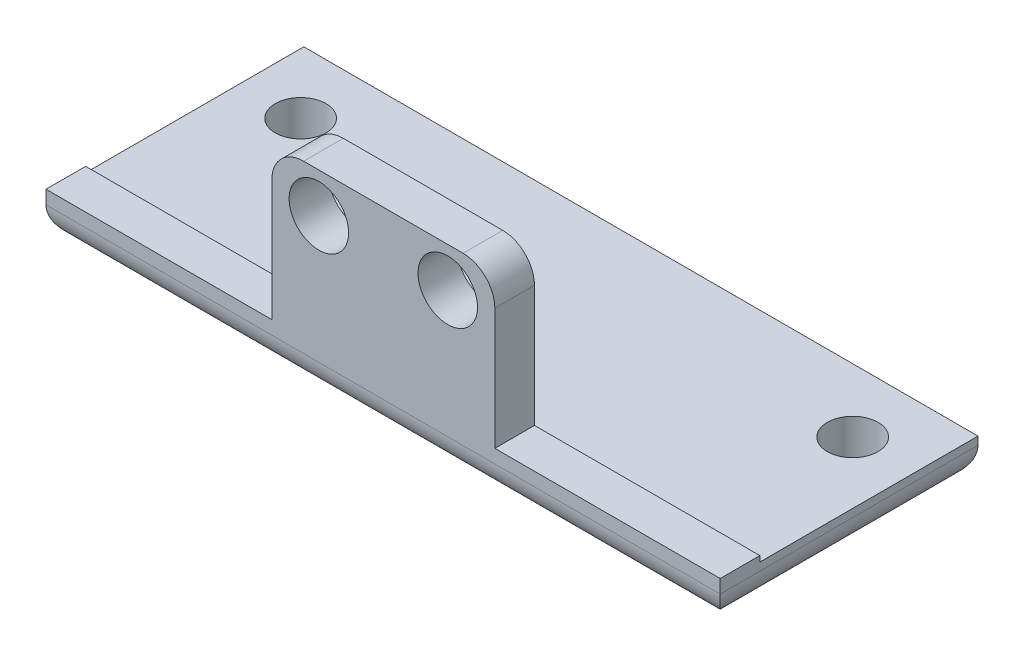
ISO-10303-21;
HEADER;
FILE_DESCRIPTION(('STEP AP214'),'2;1');
FILE_NAME('part.step','',(''),(''),'','','');
FILE_SCHEMA(('AUTOMOTIVE_DESIGN { 1 0 10303 214 1 1 1 1 }'));
ENDSEC;
DATA;
#1=APPLICATION_CONTEXT('core data for automotive mechanical design processes');
#2=APPLICATION_PROTOCOL_DEFINITION('international standard','automotive_design',2000,#1);
#3=PRODUCT_CONTEXT('',#1,'mechanical');
#4=PRODUCT('Part','Part','',(#3));
#5=PRODUCT_RELATED_PRODUCT_CATEGORY('part','',(#4));
#6=PRODUCT_DEFINITION_FORMATION('','',#4);
#7=PRODUCT_DEFINITION_CONTEXT('part definition',#1,'design');
#8=PRODUCT_DEFINITION('design','',#6,#7);
#9=PRODUCT_DEFINITION_SHAPE('','',#8);
#10=(LENGTH_UNIT() NAMED_UNIT(*) SI_UNIT(.MILLI.,.METRE.));
#11=(NAMED_UNIT(*) PLANE_ANGLE_UNIT() SI_UNIT($,.RADIAN.));
#12=(NAMED_UNIT(*) SI_UNIT($,.STERADIAN.) SOLID_ANGLE_UNIT());
#13=UNCERTAINTY_MEASURE_WITH_UNIT(LENGTH_MEASURE(1.E-05),#10,'distance_accuracy_value','');
#14=(GEOMETRIC_REPRESENTATION_CONTEXT(3) GLOBAL_UNCERTAINTY_ASSIGNED_CONTEXT((#13)) GLOBAL_UNIT_ASSIGNED_CONTEXT((#10,
#11,#12)) REPRESENTATION_CONTEXT('',''));
#15=CARTESIAN_POINT('',(0.,0.,0.));
#16=DIRECTION('',(0.,0.,1.));
#17=DIRECTION('',(1.,0.,0.));
#18=AXIS2_PLACEMENT_3D('',#15,#16,#17);
#19=CARTESIAN_POINT('',(0.,3.175,0.));
#20=DIRECTION('',(0.,-1.,0.));
#21=DIRECTION('',(0.,0.,-1.));
#22=AXIS2_PLACEMENT_3D('',#19,#20,#21);
#23=PLANE('',#22);
#24=CARTESIAN_POINT('',(49.022,3.175,-7.62));
#25=DIRECTION('',(0.,1.,0.));
#26=DIRECTION('',(0.,0.,1.));
#27=AXIS2_PLACEMENT_3D('',#24,#25,#26);
#28=CIRCLE('',#27,2.032);
#29=CARTESIAN_POINT('',(49.022,3.175,-5.588));
#30=VERTEX_POINT('',#29);
#31=EDGE_CURVE('E243',#30,#30,#28,.T.);
#32=ORIENTED_EDGE('',*,*,#31,.F.);
#33=EDGE_LOOP('',(#32));
#34=FACE_BOUND('',#33,.T.);
#35=CARTESIAN_POINT('',(4.826,3.175,-7.62));
#36=DIRECTION('',(0.,1.,0.));
#37=DIRECTION('',(0.,0.,1.));
#38=AXIS2_PLACEMENT_3D('',#35,#36,#37);
#39=CIRCLE('',#38,2.032);
#40=CARTESIAN_POINT('',(4.826,3.175,-5.588));
#41=VERTEX_POINT('',#40);
#42=EDGE_CURVE('E239',#41,#41,#39,.T.);
#43=ORIENTED_EDGE('',*,*,#42,.F.);
#44=EDGE_LOOP('',(#43));
#45=FACE_BOUND('',#44,.T.);
#46=DIRECTION('',(-1.,0.,0.));
#47=VECTOR('',#46,1.);
#48=CARTESIAN_POINT('',(0.,3.175,4.7625));
#49=LINE('',#48,#47);
#50=CARTESIAN_POINT('',(53.975,3.175,4.7625));
#51=VERTEX_POINT('',#50);
#52=CARTESIAN_POINT('',(0.,3.175,4.7625));
#53=VERTEX_POINT('',#52);
#54=EDGE_CURVE('E218',#51,#53,#49,.T.);
#55=ORIENTED_EDGE('',*,*,#54,.F.);
#56=DIRECTION('',(0.,0.,-1.));
#57=VECTOR('',#56,1.);
#58=CARTESIAN_POINT('',(53.975,3.175,0.));
#59=LINE('',#58,#57);
#60=CARTESIAN_POINT('',(53.975,3.175,-12.7));
#61=VERTEX_POINT('',#60);
#62=EDGE_CURVE('E253',#51,#61,#59,.T.);
#63=ORIENTED_EDGE('',*,*,#62,.T.);
#64=DIRECTION('',(-1.,0.,0.));
#65=VECTOR('',#64,1.);
#66=CARTESIAN_POINT('',(0.,3.175,-12.7));
#67=LINE('',#66,#65);
#68=CARTESIAN_POINT('',(0.,3.175,-12.7));
#69=VERTEX_POINT('',#68);
#70=EDGE_CURVE('E256',#61,#69,#67,.T.);
#71=ORIENTED_EDGE('',*,*,#70,.T.);
#72=DIRECTION('',(0.,0.,1.));
#73=VECTOR('',#72,1.);
#74=CARTESIAN_POINT('',(0.,3.175,0.));
#75=LINE('',#74,#73);
#76=EDGE_CURVE('E238',#69,#53,#75,.T.);
#77=ORIENTED_EDGE('',*,*,#76,.T.);
#78=EDGE_LOOP('',(#55,#63,#71,#77));
#79=FACE_BOUND('',#78,.T.);
#80=ADVANCED_FACE('F43',(#34,#45,#79),#23,.F.);
#81=CARTESIAN_POINT('',(0.,3.175,0.));
#82=DIRECTION('',(1.,0.,0.));
#83=DIRECTION('',(0.,0.,-1.));
#84=AXIS2_PLACEMENT_3D('',#81,#82,#83);
#85=PLANE('',#84);
#86=DIRECTION('',(0.,-1.,0.));
#87=VECTOR('',#86,1.);
#88=CARTESIAN_POINT('',(0.,3.175,-12.7));
#89=LINE('',#88,#87);
#90=CARTESIAN_POINT('',(0.,2.54,-12.7));
#91=VERTEX_POINT('',#90);
#92=EDGE_CURVE('E259',#69,#91,#89,.T.);
#93=ORIENTED_EDGE('',*,*,#92,.T.);
#94=DIRECTION('',(0.,0.,1.));
#95=VECTOR('',#94,1.);
#96=CARTESIAN_POINT('',(0.,2.54,7.9375));
#97=LINE('',#96,#95);
#98=CARTESIAN_POINT('',(0.,2.54,7.9375));
#99=VERTEX_POINT('',#98);
#100=EDGE_CURVE('E153',#91,#99,#97,.T.);
#101=ORIENTED_EDGE('',*,*,#100,.T.);
#102=DIRECTION('',(0.,1.,0.));
#103=VECTOR('',#102,1.);
#104=CARTESIAN_POINT('',(0.,0.,7.9375));
#105=LINE('',#104,#103);
#106=CARTESIAN_POINT('',(0.,3.62073276793495,7.9375));
#107=VERTEX_POINT('',#106);
#108=EDGE_CURVE('E146',#99,#107,#105,.T.);
#109=ORIENTED_EDGE('',*,*,#108,.T.);
#110=DIRECTION('',(0.,0.,1.));
#111=VECTOR('',#110,1.);
#112=CARTESIAN_POINT('',(0.,3.62073276793495,-4.7625));
#113=LINE('',#112,#111);
#114=CARTESIAN_POINT('',(0.,3.62073276793495,4.7625));
#115=VERTEX_POINT('',#114);
#116=EDGE_CURVE('E150',#115,#107,#113,.T.);
#117=ORIENTED_EDGE('',*,*,#116,.F.);
#118=DIRECTION('',(0.,-1.,0.));
#119=VECTOR('',#118,1.);
#120=CARTESIAN_POINT('',(0.,15.875,4.7625));
#121=LINE('',#120,#119);
#122=EDGE_CURVE('E222',#115,#53,#121,.T.);
#123=ORIENTED_EDGE('',*,*,#122,.T.);
#124=ORIENTED_EDGE('',*,*,#76,.F.);
#125=EDGE_LOOP('',(#93,#101,#109,#117,#123,#124));
#126=FACE_BOUND('',#125,.T.);
#127=ADVANCED_FACE('F149',(#126),#85,.F.);
#128=CARTESIAN_POINT('',(53.975,3.175,0.));
#129=DIRECTION('',(-1.,0.,0.));
#130=DIRECTION('',(0.,0.,1.));
#131=AXIS2_PLACEMENT_3D('',#128,#129,#130);
#132=PLANE('',#131);
#133=DIRECTION('',(0.,1.,0.));
#134=VECTOR('',#133,1.);
#135=CARTESIAN_POINT('',(53.975,0.,7.9375));
#136=LINE('',#135,#134);
#137=CARTESIAN_POINT('',(53.975,2.54,7.9375));
#138=VERTEX_POINT('',#137);
#139=CARTESIAN_POINT('',(53.975,3.62073276793495,7.9375));
#140=VERTEX_POINT('',#139);
#141=EDGE_CURVE('E159',#138,#140,#136,.T.);
#142=ORIENTED_EDGE('',*,*,#141,.F.);
#143=DIRECTION('',(0.,0.,-1.));
#144=VECTOR('',#143,1.);
#145=CARTESIAN_POINT('',(53.975,2.54,-12.7));
#146=LINE('',#145,#144);
#147=CARTESIAN_POINT('',(53.975,2.54,-12.7));
#148=VERTEX_POINT('',#147);
#149=EDGE_CURVE('E300',#138,#148,#146,.T.);
#150=ORIENTED_EDGE('',*,*,#149,.T.);
#151=DIRECTION('',(0.,-1.,0.));
#152=VECTOR('',#151,1.);
#153=CARTESIAN_POINT('',(53.975,3.175,-12.7));
#154=LINE('',#153,#152);
#155=EDGE_CURVE('E262',#61,#148,#154,.T.);
#156=ORIENTED_EDGE('',*,*,#155,.F.);
#157=ORIENTED_EDGE('',*,*,#62,.F.);
#158=DIRECTION('',(0.,-1.,0.));
#159=VECTOR('',#158,1.);
#160=CARTESIAN_POINT('',(53.975,15.875,4.7625));
#161=LINE('',#160,#159);
#162=CARTESIAN_POINT('',(53.975,3.62073276793495,4.7625));
#163=VERTEX_POINT('',#162);
#164=EDGE_CURVE('E160',#163,#51,#161,.T.);
#165=ORIENTED_EDGE('',*,*,#164,.F.);
#166=DIRECTION('',(0.,0.,1.));
#167=VECTOR('',#166,1.);
#168=CARTESIAN_POINT('',(53.975,3.62073276793495,-4.7625));
#169=LINE('',#168,#167);
#170=EDGE_CURVE('E192',#163,#140,#169,.T.);
#171=ORIENTED_EDGE('',*,*,#170,.T.);
#172=EDGE_LOOP('',(#142,#150,#156,#157,#165,#171));
#173=FACE_BOUND('',#172,.T.);
#174=ADVANCED_FACE('F358',(#173),#132,.F.);
#175=CARTESIAN_POINT('',(0.,3.175,-12.7));
#176=DIRECTION('',(0.,0.,1.));
#177=DIRECTION('',(1.,0.,0.));
#178=AXIS2_PLACEMENT_3D('',#175,#176,#177);
#179=PLANE('',#178);
#180=ORIENTED_EDGE('',*,*,#155,.T.);
#181=DIRECTION('',(-1.,0.,0.));
#182=VECTOR('',#181,1.);
#183=CARTESIAN_POINT('',(0.,2.54,-12.7));
#184=LINE('',#183,#182);
#185=EDGE_CURVE('E303',#148,#91,#184,.T.);
#186=ORIENTED_EDGE('',*,*,#185,.T.);
#187=ORIENTED_EDGE('',*,*,#92,.F.);
#188=ORIENTED_EDGE('',*,*,#70,.F.);
#189=EDGE_LOOP('',(#180,#186,#187,#188));
#190=FACE_BOUND('',#189,.T.);
#191=ADVANCED_FACE('F387',(#190),#179,.F.);
#192=CARTESIAN_POINT('',(0.,0.,0.));
#193=DIRECTION('',(0.,-1.,0.));
#194=DIRECTION('',(0.,0.,-1.));
#195=AXIS2_PLACEMENT_3D('',#192,#193,#194);
#196=PLANE('',#195);
#197=DIRECTION('',(0.,0.,-1.));
#198=VECTOR('',#197,1.);
#199=CARTESIAN_POINT('',(51.435,0.,7.9375));
#200=LINE('',#199,#198);
#201=CARTESIAN_POINT('',(51.435,0.,-10.16));
#202=VERTEX_POINT('',#201);
#203=CARTESIAN_POINT('',(51.435,0.,5.3975));
#204=VERTEX_POINT('',#203);
#205=EDGE_CURVE('E293',#202,#204,#200,.F.);
#206=ORIENTED_EDGE('',*,*,#205,.T.);
#207=DIRECTION('',(1.,0.,0.));
#208=VECTOR('',#207,1.);
#209=CARTESIAN_POINT('',(0.,0.,5.3975));
#210=LINE('',#209,#208);
#211=CARTESIAN_POINT('',(2.54,0.,5.3975));
#212=VERTEX_POINT('',#211);
#213=EDGE_CURVE('E296',#204,#212,#210,.F.);
#214=ORIENTED_EDGE('',*,*,#213,.T.);
#215=DIRECTION('',(0.,0.,1.));
#216=VECTOR('',#215,1.);
#217=CARTESIAN_POINT('',(2.54,0.,-12.7));
#218=LINE('',#217,#216);
#219=CARTESIAN_POINT('',(2.54,0.,-10.16));
#220=VERTEX_POINT('',#219);
#221=EDGE_CURVE('E287',#212,#220,#218,.F.);
#222=ORIENTED_EDGE('',*,*,#221,.T.);
#223=DIRECTION('',(-1.,0.,0.));
#224=VECTOR('',#223,1.);
#225=CARTESIAN_POINT('',(53.975,0.,-10.16));
#226=LINE('',#225,#224);
#227=EDGE_CURVE('E290',#220,#202,#226,.F.);
#228=ORIENTED_EDGE('',*,*,#227,.T.);
#229=EDGE_LOOP('',(#206,#214,#222,#228));
#230=FACE_BOUND('',#229,.T.);
#231=CARTESIAN_POINT('',(4.826,0.,-7.62));
#232=DIRECTION('',(0.,1.,0.));
#233=DIRECTION('',(0.,0.,1.));
#234=AXIS2_PLACEMENT_3D('',#231,#232,#233);
#235=CIRCLE('',#234,2.032);
#236=CARTESIAN_POINT('',(4.826,0.,-5.588));
#237=VERTEX_POINT('',#236);
#238=EDGE_CURVE('E234',#237,#237,#235,.T.);
#239=ORIENTED_EDGE('',*,*,#238,.T.);
#240=EDGE_LOOP('',(#239));
#241=FACE_BOUND('',#240,.T.);
#242=CARTESIAN_POINT('',(49.022,0.,-7.62));
#243=DIRECTION('',(0.,1.,0.));
#244=DIRECTION('',(0.,0.,1.));
#245=AXIS2_PLACEMENT_3D('',#242,#243,#244);
#246=CIRCLE('',#245,2.032);
#247=CARTESIAN_POINT('',(49.022,0.,-5.588));
#248=VERTEX_POINT('',#247);
#249=EDGE_CURVE('E232',#248,#248,#246,.T.);
#250=ORIENTED_EDGE('',*,*,#249,.T.);
#251=EDGE_LOOP('',(#250));
#252=FACE_BOUND('',#251,.T.);
#253=ADVANCED_FACE('F346',(#230,#241,#252),#196,.T.);
#254=CARTESIAN_POINT('',(49.022,0.,-7.62));
#255=DIRECTION('',(0.,1.,0.));
#256=DIRECTION('',(0.,0.,1.));
#257=AXIS2_PLACEMENT_3D('',#254,#255,#256);
#258=CYLINDRICAL_SURFACE('',#257,2.032);
#259=ORIENTED_EDGE('',*,*,#249,.F.);
#260=EDGE_LOOP('',(#259));
#261=FACE_BOUND('',#260,.T.);
#262=ORIENTED_EDGE('',*,*,#31,.T.);
#263=EDGE_LOOP('',(#262));
#264=FACE_BOUND('',#263,.T.);
#265=ADVANCED_FACE('F394',(#261,#264),#258,.F.);
#266=CARTESIAN_POINT('',(4.826,0.,-7.62));
#267=DIRECTION('',(0.,1.,0.));
#268=DIRECTION('',(0.,0.,1.));
#269=AXIS2_PLACEMENT_3D('',#266,#267,#268);
#270=CYLINDRICAL_SURFACE('',#269,2.032);
#271=ORIENTED_EDGE('',*,*,#238,.F.);
#272=EDGE_LOOP('',(#271));
#273=FACE_BOUND('',#272,.T.);
#274=ORIENTED_EDGE('',*,*,#42,.T.);
#275=EDGE_LOOP('',(#274));
#276=FACE_BOUND('',#275,.T.);
#277=ADVANCED_FACE('F409',(#273,#276),#270,.F.);
#278=CARTESIAN_POINT('',(0.,0.,7.9375));
#279=DIRECTION('',(0.,0.,1.));
#280=DIRECTION('',(1.,0.,0.));
#281=AXIS2_PLACEMENT_3D('',#278,#279,#280);
#282=PLANE('',#281);
#283=ORIENTED_EDGE('',*,*,#108,.F.);
#284=DIRECTION('',(1.,0.,0.));
#285=VECTOR('',#284,1.);
#286=CARTESIAN_POINT('',(0.,2.54,7.9375));
#287=LINE('',#286,#285);
#288=EDGE_CURVE('E284',#99,#138,#287,.T.);
#289=ORIENTED_EDGE('',*,*,#288,.T.);
#290=ORIENTED_EDGE('',*,*,#141,.T.);
#291=DIRECTION('',(1.,0.,0.));
#292=VECTOR('',#291,1.);
#293=CARTESIAN_POINT('',(53.975,3.62073276793495,7.9375));
#294=LINE('',#293,#292);
#295=CARTESIAN_POINT('',(35.9306684465608,3.62073276793495,7.9375));
#296=VERTEX_POINT('',#295);
#297=EDGE_CURVE('E182',#296,#140,#294,.T.);
#298=ORIENTED_EDGE('',*,*,#297,.F.);
#299=DIRECTION('',(0.,-1.,0.));
#300=VECTOR('',#299,1.);
#301=CARTESIAN_POINT('',(35.9306684465608,15.875,7.9375));
#302=LINE('',#301,#300);
#303=CARTESIAN_POINT('',(35.9306684465608,13.335,7.9375));
#304=VERTEX_POINT('',#303);
#305=EDGE_CURVE('E177',#304,#296,#302,.T.);
#306=ORIENTED_EDGE('',*,*,#305,.F.);
#307=CARTESIAN_POINT('',(33.3906684465608,13.335,7.9375));
#308=DIRECTION('',(0.,0.,1.));
#309=DIRECTION('',(1.,0.,0.));
#310=AXIS2_PLACEMENT_3D('',#307,#308,#309);
#311=CIRCLE('',#310,2.54);
#312=CARTESIAN_POINT('',(33.3906684465608,15.875,7.9375));
#313=VERTEX_POINT('',#312);
#314=EDGE_CURVE('E281',#304,#313,#311,.T.);
#315=ORIENTED_EDGE('',*,*,#314,.T.);
#316=DIRECTION('',(1.,0.,0.));
#317=VECTOR('',#316,1.);
#318=CARTESIAN_POINT('',(0.,15.875,7.9375));
#319=LINE('',#318,#317);
#320=CARTESIAN_POINT('',(20.6241937373089,15.875,7.9375));
#321=VERTEX_POINT('',#320);
#322=EDGE_CURVE('E213',#321,#313,#319,.T.);
#323=ORIENTED_EDGE('',*,*,#322,.F.);
#324=CARTESIAN_POINT('',(20.6241937373089,13.335,7.9375));
#325=DIRECTION('',(0.,0.,1.));
#326=DIRECTION('',(1.,0.,0.));
#327=AXIS2_PLACEMENT_3D('',#324,#325,#326);
#328=CIRCLE('',#327,2.54);
#329=CARTESIAN_POINT('',(18.0841937373089,13.335,7.9375));
#330=VERTEX_POINT('',#329);
#331=EDGE_CURVE('E278',#321,#330,#328,.T.);
#332=ORIENTED_EDGE('',*,*,#331,.T.);
#333=DIRECTION('',(0.,1.,0.));
#334=VECTOR('',#333,1.);
#335=CARTESIAN_POINT('',(18.0841937373089,15.875,7.9375));
#336=LINE('',#335,#334);
#337=CARTESIAN_POINT('',(18.0841937373089,3.62073276793495,7.9375));
#338=VERTEX_POINT('',#337);
#339=EDGE_CURVE('E172',#338,#330,#336,.T.);
#340=ORIENTED_EDGE('',*,*,#339,.F.);
#341=DIRECTION('',(1.,0.,0.));
#342=VECTOR('',#341,1.);
#343=CARTESIAN_POINT('',(0.,3.62073276793495,7.9375));
#344=LINE('',#343,#342);
#345=EDGE_CURVE('E166',#107,#338,#344,.T.);
#346=ORIENTED_EDGE('',*,*,#345,.F.);
#347=EDGE_LOOP('',(#283,#289,#290,#298,#306,#315,#323,#332,#340,#346));
#348=FACE_BOUND('',#347,.T.);
#349=CARTESIAN_POINT('',(21.844,12.7,7.9375));
#350=DIRECTION('',(0.,0.,1.));
#351=DIRECTION('',(1.,0.,0.));
#352=AXIS2_PLACEMENT_3D('',#349,#350,#351);
#353=CIRCLE('',#352,2.38125);
#354=CARTESIAN_POINT('',(24.22525,12.7,7.9375));
#355=VERTEX_POINT('',#354);
#356=EDGE_CURVE('E205',#355,#355,#353,.T.);
#357=ORIENTED_EDGE('',*,*,#356,.F.);
#358=EDGE_LOOP('',(#357));
#359=FACE_BOUND('',#358,.T.);
#360=CARTESIAN_POINT('',(32.16275,12.7,7.9375));
#361=DIRECTION('',(0.,0.,1.));
#362=DIRECTION('',(1.,0.,0.));
#363=AXIS2_PLACEMENT_3D('',#360,#361,#362);
#364=CIRCLE('',#363,2.38125);
#365=CARTESIAN_POINT('',(34.544,12.7,7.9375));
#366=VERTEX_POINT('',#365);
#367=EDGE_CURVE('E204',#366,#366,#364,.T.);
#368=ORIENTED_EDGE('',*,*,#367,.F.);
#369=EDGE_LOOP('',(#368));
#370=FACE_BOUND('',#369,.T.);
#371=ADVANCED_FACE('F174',(#348,#359,#370),#282,.T.);
#372=CARTESIAN_POINT('',(0.,15.875,4.7625));
#373=DIRECTION('',(0.,0.,1.));
#374=DIRECTION('',(1.,0.,0.));
#375=AXIS2_PLACEMENT_3D('',#372,#373,#374);
#376=PLANE('',#375);
#377=CARTESIAN_POINT('',(21.844,12.7,4.7625));
#378=DIRECTION('',(0.,0.,1.));
#379=DIRECTION('',(1.,0.,0.));
#380=AXIS2_PLACEMENT_3D('',#377,#378,#379);
#381=CIRCLE('',#380,2.38125);
#382=CARTESIAN_POINT('',(24.22525,12.7,4.7625));
#383=VERTEX_POINT('',#382);
#384=EDGE_CURVE('E226',#383,#383,#381,.T.);
#385=ORIENTED_EDGE('',*,*,#384,.T.);
#386=EDGE_LOOP('',(#385));
#387=FACE_BOUND('',#386,.T.);
#388=CARTESIAN_POINT('',(32.16275,12.7,4.7625));
#389=DIRECTION('',(0.,0.,1.));
#390=DIRECTION('',(1.,0.,0.));
#391=AXIS2_PLACEMENT_3D('',#388,#389,#390);
#392=CIRCLE('',#391,2.38125);
#393=CARTESIAN_POINT('',(34.544,12.7,4.7625));
#394=VERTEX_POINT('',#393);
#395=EDGE_CURVE('E209',#394,#394,#392,.T.);
#396=ORIENTED_EDGE('',*,*,#395,.T.);
#397=EDGE_LOOP('',(#396));
#398=FACE_BOUND('',#397,.T.);
#399=DIRECTION('',(-1.,0.,0.));
#400=VECTOR('',#399,1.);
#401=CARTESIAN_POINT('',(0.,15.875,4.7625));
#402=LINE('',#401,#400);
#403=CARTESIAN_POINT('',(33.3906684465608,15.875,4.7625));
#404=VERTEX_POINT('',#403);
#405=CARTESIAN_POINT('',(20.6241937373089,15.875,4.7625));
#406=VERTEX_POINT('',#405);
#407=EDGE_CURVE('E217',#404,#406,#402,.T.);
#408=ORIENTED_EDGE('',*,*,#407,.F.);
#409=CARTESIAN_POINT('',(33.3906684465608,13.335,4.7625));
#410=DIRECTION('',(0.,0.,1.));
#411=DIRECTION('',(1.,0.,0.));
#412=AXIS2_PLACEMENT_3D('',#409,#410,#411);
#413=CIRCLE('',#412,2.54);
#414=CARTESIAN_POINT('',(35.9306684465608,13.335,4.7625));
#415=VERTEX_POINT('',#414);
#416=EDGE_CURVE('E61',#404,#415,#413,.F.);
#417=ORIENTED_EDGE('',*,*,#416,.T.);
#418=DIRECTION('',(0.,-1.,0.));
#419=VECTOR('',#418,1.);
#420=CARTESIAN_POINT('',(35.9306684465608,15.875,4.7625));
#421=LINE('',#420,#419);
#422=CARTESIAN_POINT('',(35.9306684465608,3.62073276793495,4.7625));
#423=VERTEX_POINT('',#422);
#424=EDGE_CURVE('E186',#415,#423,#421,.T.);
#425=ORIENTED_EDGE('',*,*,#424,.T.);
#426=DIRECTION('',(1.,0.,0.));
#427=VECTOR('',#426,1.);
#428=CARTESIAN_POINT('',(0.,3.62073276793495,4.7625));
#429=LINE('',#428,#427);
#430=EDGE_CURVE('E266',#423,#163,#429,.T.);
#431=ORIENTED_EDGE('',*,*,#430,.T.);
#432=ORIENTED_EDGE('',*,*,#164,.T.);
#433=ORIENTED_EDGE('',*,*,#54,.T.);
#434=ORIENTED_EDGE('',*,*,#122,.F.);
#435=DIRECTION('',(1.,0.,0.));
#436=VECTOR('',#435,1.);
#437=CARTESIAN_POINT('',(0.,3.62073276793495,4.7625));
#438=LINE('',#437,#436);
#439=CARTESIAN_POINT('',(18.0841937373089,3.62073276793495,4.7625));
#440=VERTEX_POINT('',#439);
#441=EDGE_CURVE('E169',#115,#440,#438,.T.);
#442=ORIENTED_EDGE('',*,*,#441,.T.);
#443=DIRECTION('',(0.,1.,0.));
#444=VECTOR('',#443,1.);
#445=CARTESIAN_POINT('',(18.0841937373089,15.875,4.7625));
#446=LINE('',#445,#444);
#447=CARTESIAN_POINT('',(18.0841937373089,13.335,4.7625));
#448=VERTEX_POINT('',#447);
#449=EDGE_CURVE('E201',#440,#448,#446,.T.);
#450=ORIENTED_EDGE('',*,*,#449,.T.);
#451=CARTESIAN_POINT('',(20.6241937373089,13.335,4.7625));
#452=DIRECTION('',(0.,0.,1.));
#453=DIRECTION('',(1.,0.,0.));
#454=AXIS2_PLACEMENT_3D('',#451,#452,#453);
#455=CIRCLE('',#454,2.54);
#456=EDGE_CURVE('E316',#448,#406,#455,.F.);
#457=ORIENTED_EDGE('',*,*,#456,.T.);
#458=EDGE_LOOP('',(#408,#417,#425,#431,#432,#433,#434,#442,#450,#457));
#459=FACE_BOUND('',#458,.T.);
#460=ADVANCED_FACE('F365',(#387,#398,#459),#376,.F.);
#461=CARTESIAN_POINT('',(0.,15.875,0.));
#462=DIRECTION('',(0.,-1.,0.));
#463=DIRECTION('',(0.,0.,-1.));
#464=AXIS2_PLACEMENT_3D('',#461,#462,#463);
#465=PLANE('',#464);
#466=ORIENTED_EDGE('',*,*,#322,.T.);
#467=DIRECTION('',(0.,0.,-1.));
#468=VECTOR('',#467,1.);
#469=CARTESIAN_POINT('',(33.3906684465608,15.875,0.));
#470=LINE('',#469,#468);
#471=EDGE_CURVE('E312',#313,#404,#470,.T.);
#472=ORIENTED_EDGE('',*,*,#471,.T.);
#473=ORIENTED_EDGE('',*,*,#407,.T.);
#474=DIRECTION('',(0.,0.,1.));
#475=VECTOR('',#474,1.);
#476=CARTESIAN_POINT('',(20.6241937373089,15.875,0.));
#477=LINE('',#476,#475);
#478=EDGE_CURVE('E308',#406,#321,#477,.T.);
#479=ORIENTED_EDGE('',*,*,#478,.T.);
#480=EDGE_LOOP('',(#466,#472,#473,#479));
#481=FACE_BOUND('',#480,.T.);
#482=ADVANCED_FACE('F377',(#481),#465,.F.);
#483=CARTESIAN_POINT('',(32.16275,12.7,-4.7625));
#484=DIRECTION('',(0.,0.,1.));
#485=DIRECTION('',(1.,0.,0.));
#486=AXIS2_PLACEMENT_3D('',#483,#484,#485);
#487=CYLINDRICAL_SURFACE('',#486,2.38125);
#488=ORIENTED_EDGE('',*,*,#367,.T.);
#489=EDGE_LOOP('',(#488));
#490=FACE_BOUND('',#489,.T.);
#491=ORIENTED_EDGE('',*,*,#395,.F.);
#492=EDGE_LOOP('',(#491));
#493=FACE_BOUND('',#492,.T.);
#494=ADVANCED_FACE('F421',(#490,#493),#487,.F.);
#495=CARTESIAN_POINT('',(21.844,12.7,-4.7625));
#496=DIRECTION('',(0.,0.,1.));
#497=DIRECTION('',(1.,0.,0.));
#498=AXIS2_PLACEMENT_3D('',#495,#496,#497);
#499=CYLINDRICAL_SURFACE('',#498,2.38125);
#500=ORIENTED_EDGE('',*,*,#356,.T.);
#501=EDGE_LOOP('',(#500));
#502=FACE_BOUND('',#501,.T.);
#503=ORIENTED_EDGE('',*,*,#384,.F.);
#504=EDGE_LOOP('',(#503));
#505=FACE_BOUND('',#504,.T.);
#506=ADVANCED_FACE('F424',(#502,#505),#499,.F.);
#507=CARTESIAN_POINT('',(53.975,3.62073276793495,-4.7625));
#508=DIRECTION('',(0.,-1.,0.));
#509=DIRECTION('',(0.,0.,-1.));
#510=AXIS2_PLACEMENT_3D('',#507,#508,#509);
#511=PLANE('',#510);
#512=DIRECTION('',(0.,0.,1.));
#513=VECTOR('',#512,1.);
#514=CARTESIAN_POINT('',(35.9306684465608,3.62073276793495,-4.7625));
#515=LINE('',#514,#513);
#516=EDGE_CURVE('E188',#423,#296,#515,.T.);
#517=ORIENTED_EDGE('',*,*,#516,.T.);
#518=ORIENTED_EDGE('',*,*,#297,.T.);
#519=ORIENTED_EDGE('',*,*,#170,.F.);
#520=ORIENTED_EDGE('',*,*,#430,.F.);
#521=EDGE_LOOP('',(#517,#518,#519,#520));
#522=FACE_BOUND('',#521,.T.);
#523=ADVANCED_FACE('F363',(#522),#511,.F.);
#524=CARTESIAN_POINT('',(35.9306684465608,15.875,-4.7625));
#525=DIRECTION('',(-1.,0.,0.));
#526=DIRECTION('',(0.,0.,1.));
#527=AXIS2_PLACEMENT_3D('',#524,#525,#526);
#528=PLANE('',#527);
#529=ORIENTED_EDGE('',*,*,#424,.F.);
#530=DIRECTION('',(0.,0.,-1.));
#531=VECTOR('',#530,1.);
#532=CARTESIAN_POINT('',(35.9306684465608,13.335,-4.7625));
#533=LINE('',#532,#531);
#534=EDGE_CURVE('E53',#415,#304,#533,.F.);
#535=ORIENTED_EDGE('',*,*,#534,.T.);
#536=ORIENTED_EDGE('',*,*,#305,.T.);
#537=ORIENTED_EDGE('',*,*,#516,.F.);
#538=EDGE_LOOP('',(#529,#535,#536,#537));
#539=FACE_BOUND('',#538,.T.);
#540=ADVANCED_FACE('F369',(#539),#528,.F.);
#541=CARTESIAN_POINT('',(0.,3.62073276793495,-4.7625));
#542=DIRECTION('',(0.,-1.,0.));
#543=DIRECTION('',(0.,0.,-1.));
#544=AXIS2_PLACEMENT_3D('',#541,#542,#543);
#545=PLANE('',#544);
#546=ORIENTED_EDGE('',*,*,#116,.T.);
#547=ORIENTED_EDGE('',*,*,#345,.T.);
#548=DIRECTION('',(0.,0.,1.));
#549=VECTOR('',#548,1.);
#550=CARTESIAN_POINT('',(18.0841937373089,3.62073276793495,-4.7625));
#551=LINE('',#550,#549);
#552=EDGE_CURVE('E171',#440,#338,#551,.T.);
#553=ORIENTED_EDGE('',*,*,#552,.F.);
#554=ORIENTED_EDGE('',*,*,#441,.F.);
#555=EDGE_LOOP('',(#546,#547,#553,#554));
#556=FACE_BOUND('',#555,.T.);
#557=ADVANCED_FACE('F164',(#556),#545,.F.);
#558=CARTESIAN_POINT('',(18.0841937373089,15.875,-4.7625));
#559=DIRECTION('',(1.,0.,0.));
#560=DIRECTION('',(0.,0.,-1.));
#561=AXIS2_PLACEMENT_3D('',#558,#559,#560);
#562=PLANE('',#561);
#563=ORIENTED_EDGE('',*,*,#339,.T.);
#564=DIRECTION('',(0.,0.,1.));
#565=VECTOR('',#564,1.);
#566=CARTESIAN_POINT('',(18.0841937373089,13.335,-4.7625));
#567=LINE('',#566,#565);
#568=EDGE_CURVE('E11',#330,#448,#567,.F.);
#569=ORIENTED_EDGE('',*,*,#568,.T.);
#570=ORIENTED_EDGE('',*,*,#449,.F.);
#571=ORIENTED_EDGE('',*,*,#552,.T.);
#572=EDGE_LOOP('',(#563,#569,#570,#571));
#573=FACE_BOUND('',#572,.T.);
#574=ADVANCED_FACE('F381',(#573),#562,.F.);
#575=CARTESIAN_POINT('',(0.,2.54,-10.16));
#576=DIRECTION('',(1.,0.,0.));
#577=DIRECTION('',(0.,0.,-1.));
#578=AXIS2_PLACEMENT_3D('',#575,#576,#577);
#579=CYLINDRICAL_SURFACE('',#578,2.54);
#580=CARTESIAN_POINT('',(51.435,2.54,-10.16));
#581=DIRECTION('',(0.707106781186547,0.,0.707106781186547));
#582=DIRECTION('',(0.707106781186547,0.,-0.707106781186547));
#583=AXIS2_PLACEMENT_3D('',#580,#581,#582);
#584=ELLIPSE('',#583,3.59210244842766,2.54);
#585=EDGE_CURVE('E328',#202,#148,#584,.T.);
#586=ORIENTED_EDGE('',*,*,#585,.F.);
#587=ORIENTED_EDGE('',*,*,#227,.F.);
#588=CARTESIAN_POINT('',(2.54,2.54,-10.16));
#589=DIRECTION('',(0.707106781186547,0.,-0.707106781186547));
#590=DIRECTION('',(-0.707106781186547,0.,-0.707106781186547));
#591=AXIS2_PLACEMENT_3D('',#588,#589,#590);
#592=ELLIPSE('',#591,3.59210244842766,2.54);
#593=EDGE_CURVE('E47',#91,#220,#592,.F.);
#594=ORIENTED_EDGE('',*,*,#593,.F.);
#595=ORIENTED_EDGE('',*,*,#185,.F.);
#596=EDGE_LOOP('',(#586,#587,#594,#595));
#597=FACE_BOUND('',#596,.T.);
#598=ADVANCED_FACE('F344',(#597),#579,.T.);
#599=CARTESIAN_POINT('',(2.54,2.54,0.));
#600=DIRECTION('',(0.,0.,-1.));
#601=DIRECTION('',(-1.,0.,0.));
#602=AXIS2_PLACEMENT_3D('',#599,#600,#601);
#603=CYLINDRICAL_SURFACE('',#602,2.54);
#604=ORIENTED_EDGE('',*,*,#593,.T.);
#605=ORIENTED_EDGE('',*,*,#221,.F.);
#606=CARTESIAN_POINT('',(2.54,2.54,5.3975));
#607=DIRECTION('',(-0.707106781186547,0.,-0.707106781186547));
#608=DIRECTION('',(0.707106781186547,0.,-0.707106781186547));
#609=AXIS2_PLACEMENT_3D('',#606,#607,#608);
#610=ELLIPSE('',#609,3.59210244842766,2.54);
#611=EDGE_CURVE('E326',#99,#212,#610,.F.);
#612=ORIENTED_EDGE('',*,*,#611,.F.);
#613=ORIENTED_EDGE('',*,*,#100,.F.);
#614=EDGE_LOOP('',(#604,#605,#612,#613));
#615=FACE_BOUND('',#614,.T.);
#616=ADVANCED_FACE('F340',(#615),#603,.T.);
#617=CARTESIAN_POINT('',(51.435,2.54,0.));
#618=DIRECTION('',(0.,0.,1.));
#619=DIRECTION('',(1.,0.,0.));
#620=AXIS2_PLACEMENT_3D('',#617,#618,#619);
#621=CYLINDRICAL_SURFACE('',#620,2.54);
#622=ORIENTED_EDGE('',*,*,#585,.T.);
#623=ORIENTED_EDGE('',*,*,#149,.F.);
#624=CARTESIAN_POINT('',(51.435,2.54,5.3975));
#625=DIRECTION('',(-0.707106781186547,0.,0.707106781186547));
#626=DIRECTION('',(0.707106781186547,0.,0.707106781186547));
#627=AXIS2_PLACEMENT_3D('',#624,#625,#626);
#628=ELLIPSE('',#627,3.59210244842766,2.54);
#629=EDGE_CURVE('E323',#204,#138,#628,.T.);
#630=ORIENTED_EDGE('',*,*,#629,.F.);
#631=ORIENTED_EDGE('',*,*,#205,.F.);
#632=EDGE_LOOP('',(#622,#623,#630,#631));
#633=FACE_BOUND('',#632,.T.);
#634=ADVANCED_FACE('F353',(#633),#621,.T.);
#635=CARTESIAN_POINT('',(0.,2.54,5.3975));
#636=DIRECTION('',(1.,0.,0.));
#637=DIRECTION('',(0.,0.,-1.));
#638=AXIS2_PLACEMENT_3D('',#635,#636,#637);
#639=CYLINDRICAL_SURFACE('',#638,2.54);
#640=ORIENTED_EDGE('',*,*,#611,.T.);
#641=ORIENTED_EDGE('',*,*,#213,.F.);
#642=ORIENTED_EDGE('',*,*,#629,.T.);
#643=ORIENTED_EDGE('',*,*,#288,.F.);
#644=EDGE_LOOP('',(#640,#641,#642,#643));
#645=FACE_BOUND('',#644,.T.);
#646=ADVANCED_FACE('F351',(#645),#639,.T.);
#647=CARTESIAN_POINT('',(33.3906684465608,13.335,0.));
#648=DIRECTION('',(0.,0.,-1.));
#649=DIRECTION('',(-1.,0.,0.));
#650=AXIS2_PLACEMENT_3D('',#647,#648,#649);
#651=CYLINDRICAL_SURFACE('',#650,2.54);
#652=ORIENTED_EDGE('',*,*,#314,.F.);
#653=ORIENTED_EDGE('',*,*,#534,.F.);
#654=ORIENTED_EDGE('',*,*,#416,.F.);
#655=ORIENTED_EDGE('',*,*,#471,.F.);
#656=EDGE_LOOP('',(#652,#653,#654,#655));
#657=FACE_BOUND('',#656,.T.);
#658=ADVANCED_FACE('F373',(#657),#651,.T.);
#659=CARTESIAN_POINT('',(20.6241937373089,13.335,0.));
#660=DIRECTION('',(0.,0.,1.));
#661=DIRECTION('',(1.,0.,0.));
#662=AXIS2_PLACEMENT_3D('',#659,#660,#661);
#663=CYLINDRICAL_SURFACE('',#662,2.54);
#664=ORIENTED_EDGE('',*,*,#456,.F.);
#665=ORIENTED_EDGE('',*,*,#568,.F.);
#666=ORIENTED_EDGE('',*,*,#331,.F.);
#667=ORIENTED_EDGE('',*,*,#478,.F.);
#668=EDGE_LOOP('',(#664,#665,#666,#667));
#669=FACE_BOUND('',#668,.T.);
#670=ADVANCED_FACE('F45',(#669),#663,.T.);
#671=CLOSED_SHELL('',(#80,#127,#174,#191,#253,#265,#277,#371,#460,#482,#494,#506,#523,#540,#557,
#574,#598,#616,#634,#646,#658,#670));
#672=MANIFOLD_SOLID_BREP('B2',#671);
#673=ADVANCED_BREP_SHAPE_REPRESENTATION('',(#18,#672),#14);
#674=SHAPE_DEFINITION_REPRESENTATION(#9,#673);
ENDSEC;
END-ISO-10303-21;
